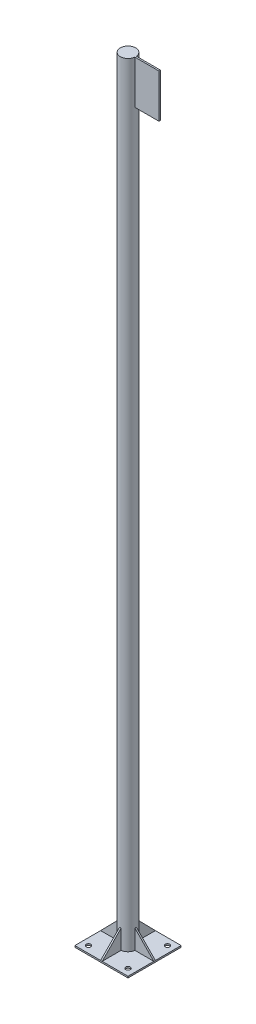
ISO-10303-21;
HEADER;
FILE_DESCRIPTION(('STEP AP214'),'2;1');
FILE_NAME('part.step','',(''),(''),'','','');
FILE_SCHEMA(('AUTOMOTIVE_DESIGN { 1 0 10303 214 1 1 1 1 }'));
ENDSEC;
DATA;
#1=APPLICATION_CONTEXT('core data for automotive mechanical design processes');
#2=APPLICATION_PROTOCOL_DEFINITION('international standard','automotive_design',2000,#1);
#3=PRODUCT_CONTEXT('',#1,'mechanical');
#4=PRODUCT('Part','Part','',(#3));
#5=PRODUCT_RELATED_PRODUCT_CATEGORY('part','',(#4));
#6=PRODUCT_DEFINITION_FORMATION('','',#4);
#7=PRODUCT_DEFINITION_CONTEXT('part definition',#1,'design');
#8=PRODUCT_DEFINITION('design','',#6,#7);
#9=PRODUCT_DEFINITION_SHAPE('','',#8);
#10=(LENGTH_UNIT() NAMED_UNIT(*) SI_UNIT(.MILLI.,.METRE.));
#11=(NAMED_UNIT(*) PLANE_ANGLE_UNIT() SI_UNIT($,.RADIAN.));
#12=(NAMED_UNIT(*) SI_UNIT($,.STERADIAN.) SOLID_ANGLE_UNIT());
#13=UNCERTAINTY_MEASURE_WITH_UNIT(LENGTH_MEASURE(1.E-05),#10,'distance_accuracy_value','');
#14=(GEOMETRIC_REPRESENTATION_CONTEXT(3) GLOBAL_UNCERTAINTY_ASSIGNED_CONTEXT((#13)) GLOBAL_UNIT_ASSIGNED_CONTEXT((#10,
#11,#12)) REPRESENTATION_CONTEXT('',''));
#15=CARTESIAN_POINT('',(0.,0.,0.));
#16=DIRECTION('',(0.,0.,1.));
#17=DIRECTION('',(1.,0.,0.));
#18=AXIS2_PLACEMENT_3D('',#15,#16,#17);
#19=CARTESIAN_POINT('',(0.,6.35,0.));
#20=DIRECTION('',(0.,-1.,0.));
#21=DIRECTION('',(0.,0.,-1.));
#22=AXIS2_PLACEMENT_3D('',#19,#20,#21);
#23=PLANE('',#22);
#24=CARTESIAN_POINT('',(191.715728752538,6.35,-28.2842712474619));
#25=DIRECTION('',(0.,1.,0.));
#26=DIRECTION('',(0.,0.,-1.));
#27=AXIS2_PLACEMENT_3D('',#24,#25,#26);
#28=CIRCLE('',#27,9.525);
#29=CARTESIAN_POINT('',(191.715728752538,6.35,-37.8092712474619));
#30=VERTEX_POINT('',#29);
#31=EDGE_CURVE('E216',#30,#30,#28,.T.);
#32=ORIENTED_EDGE('',*,*,#31,.F.);
#33=EDGE_LOOP('',(#32));
#34=FACE_BOUND('',#33,.T.);
#35=DIRECTION('',(1.,0.,0.));
#36=VECTOR('',#35,1.);
#37=CARTESIAN_POINT('',(220.,6.35,-106.825));
#38=LINE('',#37,#36);
#39=CARTESIAN_POINT('',(141.590851128135,6.34999999999986,-106.825));
#40=VERTEX_POINT('',#39);
#41=CARTESIAN_POINT('',(220.,6.35,-106.825));
#42=VERTEX_POINT('',#41);
#43=EDGE_CURVE('E276',#40,#42,#38,.T.);
#44=ORIENTED_EDGE('',*,*,#43,.F.);
#45=CARTESIAN_POINT('',(110.,6.34999999999986,-110.));
#46=DIRECTION('',(0.,-1.,0.));
#47=DIRECTION('',(0.,0.,-1.));
#48=AXIS2_PLACEMENT_3D('',#45,#46,#47);
#49=CIRCLE('',#48,31.75);
#50=CARTESIAN_POINT('',(113.175,6.34999999999986,-78.4091488718648));
#51=VERTEX_POINT('',#50);
#52=EDGE_CURVE('E41',#51,#40,#49,.F.);
#53=ORIENTED_EDGE('',*,*,#52,.F.);
#54=DIRECTION('',(0.,0.,-1.));
#55=VECTOR('',#54,1.);
#56=CARTESIAN_POINT('',(113.175,6.35,0.));
#57=LINE('',#56,#55);
#58=CARTESIAN_POINT('',(113.175,6.35,0.));
#59=VERTEX_POINT('',#58);
#60=EDGE_CURVE('E293',#59,#51,#57,.T.);
#61=ORIENTED_EDGE('',*,*,#60,.F.);
#62=DIRECTION('',(1.,0.,0.));
#63=VECTOR('',#62,1.);
#64=CARTESIAN_POINT('',(0.,6.35,0.));
#65=LINE('',#64,#63);
#66=CARTESIAN_POINT('',(220.,6.35,0.));
#67=VERTEX_POINT('',#66);
#68=EDGE_CURVE('E336',#59,#67,#65,.T.);
#69=ORIENTED_EDGE('',*,*,#68,.T.);
#70=DIRECTION('',(0.,0.,-1.));
#71=VECTOR('',#70,1.);
#72=CARTESIAN_POINT('',(220.,6.35,0.));
#73=LINE('',#72,#71);
#74=EDGE_CURVE('E342',#67,#42,#73,.T.);
#75=ORIENTED_EDGE('',*,*,#74,.T.);
#76=EDGE_LOOP('',(#44,#53,#61,#69,#75));
#77=FACE_BOUND('',#76,.T.);
#78=ADVANCED_FACE('F33',(#34,#77),#23,.F.);
#79=CARTESIAN_POINT('',(191.715728752538,6.35,-191.715728752538));
#80=DIRECTION('',(0.,1.,0.));
#81=DIRECTION('',(0.,0.,1.));
#82=AXIS2_PLACEMENT_3D('',#79,#80,#81);
#83=CIRCLE('',#82,9.52499999999999);
#84=CARTESIAN_POINT('',(191.715728752538,6.35,-182.190728752538));
#85=VERTEX_POINT('',#84);
#86=EDGE_CURVE('E215',#85,#85,#83,.T.);
#87=ORIENTED_EDGE('',*,*,#86,.F.);
#88=EDGE_LOOP('',(#87));
#89=FACE_BOUND('',#88,.T.);
#90=DIRECTION('',(-1.,0.,0.));
#91=VECTOR('',#90,1.);
#92=CARTESIAN_POINT('',(220.,6.35,-113.175));
#93=LINE('',#92,#91);
#94=CARTESIAN_POINT('',(220.,6.35,-113.175));
#95=VERTEX_POINT('',#94);
#96=CARTESIAN_POINT('',(141.590851128135,6.34999999999986,-113.175));
#97=VERTEX_POINT('',#96);
#98=EDGE_CURVE('E280',#95,#97,#93,.T.);
#99=ORIENTED_EDGE('',*,*,#98,.F.);
#100=CARTESIAN_POINT('',(220.,6.35,-220.));
#101=VERTEX_POINT('',#100);
#102=EDGE_CURVE('E341',#95,#101,#73,.T.);
#103=ORIENTED_EDGE('',*,*,#102,.T.);
#104=DIRECTION('',(-1.,0.,0.));
#105=VECTOR('',#104,1.);
#106=CARTESIAN_POINT('',(0.,6.35,-220.));
#107=LINE('',#106,#105);
#108=CARTESIAN_POINT('',(113.175,6.35,-220.));
#109=VERTEX_POINT('',#108);
#110=EDGE_CURVE('E346',#101,#109,#107,.T.);
#111=ORIENTED_EDGE('',*,*,#110,.T.);
#112=DIRECTION('',(0.,0.,-1.));
#113=VECTOR('',#112,1.);
#114=CARTESIAN_POINT('',(113.175,6.35,-220.));
#115=LINE('',#114,#113);
#116=CARTESIAN_POINT('',(113.175,6.34999999999986,-141.590851128135));
#117=VERTEX_POINT('',#116);
#118=EDGE_CURVE('E307',#117,#109,#115,.T.);
#119=ORIENTED_EDGE('',*,*,#118,.F.);
#120=EDGE_CURVE('E42',#97,#117,#49,.F.);
#121=ORIENTED_EDGE('',*,*,#120,.F.);
#122=EDGE_LOOP('',(#99,#103,#111,#119,#121));
#123=FACE_BOUND('',#122,.T.);
#124=ADVANCED_FACE('F447',(#89,#123),#23,.F.);
#125=CARTESIAN_POINT('',(110.,3206.35,-110.));
#126=DIRECTION('',(0.,-1.,0.));
#127=DIRECTION('',(0.,0.,-1.));
#128=AXIS2_PLACEMENT_3D('',#125,#126,#127);
#129=CYLINDRICAL_SURFACE('',#128,31.75);
#130=CARTESIAN_POINT('',(110.,3026.35,-110.));
#131=DIRECTION('',(0.,-1.,0.));
#132=DIRECTION('',(0.,0.,-1.));
#133=AXIS2_PLACEMENT_3D('',#130,#131,#132);
#134=CIRCLE('',#133,31.7500000000002);
#135=CARTESIAN_POINT('',(141.590851128135,3026.35,-113.175));
#136=VERTEX_POINT('',#135);
#137=CARTESIAN_POINT('',(141.590851128135,3026.35,-106.825));
#138=VERTEX_POINT('',#137);
#139=EDGE_CURVE('E192',#136,#138,#134,.T.);
#140=ORIENTED_EDGE('',*,*,#139,.T.);
#141=DIRECTION('',(0.,1.,0.));
#142=VECTOR('',#141,1.);
#143=CARTESIAN_POINT('',(141.590851128135,3026.35,-106.825));
#144=LINE('',#143,#142);
#145=CARTESIAN_POINT('',(141.590851128135,3206.35,-106.825));
#146=VERTEX_POINT('',#145);
#147=EDGE_CURVE('E208',#138,#146,#144,.T.);
#148=ORIENTED_EDGE('',*,*,#147,.T.);
#149=CARTESIAN_POINT('',(110.,3206.35,-110.));
#150=DIRECTION('',(0.,1.,0.));
#151=DIRECTION('',(0.,0.,1.));
#152=AXIS2_PLACEMENT_3D('',#149,#150,#151);
#153=CIRCLE('',#152,31.75);
#154=CARTESIAN_POINT('',(141.590851128135,3206.35,-113.175));
#155=VERTEX_POINT('',#154);
#156=EDGE_CURVE('E330',#155,#146,#153,.T.);
#157=ORIENTED_EDGE('',*,*,#156,.F.);
#158=DIRECTION('',(0.,1.,0.));
#159=VECTOR('',#158,1.);
#160=CARTESIAN_POINT('',(141.590851128135,3026.35,-113.175));
#161=LINE('',#160,#159);
#162=EDGE_CURVE('E182',#136,#155,#161,.T.);
#163=ORIENTED_EDGE('',*,*,#162,.F.);
#164=EDGE_LOOP('',(#140,#148,#157,#163));
#165=FACE_BOUND('',#164,.T.);
#166=DIRECTION('',(0.,-1.,0.));
#167=VECTOR('',#166,1.);
#168=CARTESIAN_POINT('',(141.590851128135,86.35,-106.825));
#169=LINE('',#168,#167);
#170=CARTESIAN_POINT('',(141.590851128135,86.3499999999999,-106.825));
#171=VERTEX_POINT('',#170);
#172=EDGE_CURVE('E286',#171,#40,#169,.T.);
#173=ORIENTED_EDGE('',*,*,#172,.F.);
#174=CARTESIAN_POINT('',(110.,86.35,-110.));
#175=DIRECTION('',(0.,-1.,0.));
#176=DIRECTION('',(0.,0.,1.));
#177=AXIS2_PLACEMENT_3D('',#174,#175,#176);
#178=CIRCLE('',#177,31.75);
#179=CARTESIAN_POINT('',(141.590851128135,86.3499999999999,-113.175));
#180=VERTEX_POINT('',#179);
#181=EDGE_CURVE('E278',#180,#171,#178,.T.);
#182=ORIENTED_EDGE('',*,*,#181,.F.);
#183=DIRECTION('',(0.,-1.,0.));
#184=VECTOR('',#183,1.);
#185=CARTESIAN_POINT('',(141.590851128135,86.35,-113.175));
#186=LINE('',#185,#184);
#187=EDGE_CURVE('E58',#180,#97,#186,.T.);
#188=ORIENTED_EDGE('',*,*,#187,.T.);
#189=ORIENTED_EDGE('',*,*,#120,.T.);
#190=DIRECTION('',(0.,-1.,0.));
#191=VECTOR('',#190,1.);
#192=CARTESIAN_POINT('',(113.175,86.35,-141.590851128135));
#193=LINE('',#192,#191);
#194=CARTESIAN_POINT('',(113.175,86.3499999999999,-141.590851128135));
#195=VERTEX_POINT('',#194);
#196=EDGE_CURVE('E306',#195,#117,#193,.T.);
#197=ORIENTED_EDGE('',*,*,#196,.F.);
#198=CARTESIAN_POINT('',(110.,86.35,-110.));
#199=DIRECTION('',(0.,-1.,0.));
#200=DIRECTION('',(0.,0.,-1.));
#201=AXIS2_PLACEMENT_3D('',#198,#199,#200);
#202=CIRCLE('',#201,31.7500000000003);
#203=CARTESIAN_POINT('',(106.825,86.3499999999999,-141.590851128135));
#204=VERTEX_POINT('',#203);
#205=EDGE_CURVE('E303',#204,#195,#202,.T.);
#206=ORIENTED_EDGE('',*,*,#205,.F.);
#207=DIRECTION('',(0.,-1.,0.));
#208=VECTOR('',#207,1.);
#209=CARTESIAN_POINT('',(106.825,86.35,-141.590851128135));
#210=LINE('',#209,#208);
#211=CARTESIAN_POINT('',(106.825,6.34999999999986,-141.590851128135));
#212=VERTEX_POINT('',#211);
#213=EDGE_CURVE('E314',#204,#212,#210,.T.);
#214=ORIENTED_EDGE('',*,*,#213,.T.);
#215=CARTESIAN_POINT('',(78.4091488718648,6.34999999999986,-113.175));
#216=VERTEX_POINT('',#215);
#217=EDGE_CURVE('E43',#212,#216,#49,.F.);
#218=ORIENTED_EDGE('',*,*,#217,.T.);
#219=DIRECTION('',(0.,-1.,0.));
#220=VECTOR('',#219,1.);
#221=CARTESIAN_POINT('',(78.4091488718648,86.35,-113.175));
#222=LINE('',#221,#220);
#223=CARTESIAN_POINT('',(78.4091488718648,86.35,-113.175));
#224=VERTEX_POINT('',#223);
#225=EDGE_CURVE('E320',#224,#216,#222,.T.);
#226=ORIENTED_EDGE('',*,*,#225,.F.);
#227=CARTESIAN_POINT('',(110.,86.35,-110.));
#228=DIRECTION('',(0.,-1.,0.));
#229=DIRECTION('',(0.,0.,-1.));
#230=AXIS2_PLACEMENT_3D('',#227,#228,#229);
#231=CIRCLE('',#230,31.75);
#232=CARTESIAN_POINT('',(78.4091488718648,86.3499999999999,-106.825));
#233=VERTEX_POINT('',#232);
#234=EDGE_CURVE('E317',#233,#224,#231,.T.);
#235=ORIENTED_EDGE('',*,*,#234,.F.);
#236=DIRECTION('',(0.,-1.,0.));
#237=VECTOR('',#236,1.);
#238=CARTESIAN_POINT('',(78.4091488718648,86.35,-106.825));
#239=LINE('',#238,#237);
#240=CARTESIAN_POINT('',(78.4091488718648,6.34999999999986,-106.825));
#241=VERTEX_POINT('',#240);
#242=EDGE_CURVE('E328',#233,#241,#239,.T.);
#243=ORIENTED_EDGE('',*,*,#242,.T.);
#244=CARTESIAN_POINT('',(106.825,6.34999999999986,-78.4091488718648));
#245=VERTEX_POINT('',#244);
#246=EDGE_CURVE('E11',#241,#245,#49,.F.);
#247=ORIENTED_EDGE('',*,*,#246,.T.);
#248=DIRECTION('',(0.,-1.,0.));
#249=VECTOR('',#248,1.);
#250=CARTESIAN_POINT('',(106.825,86.35,-78.4091488718648));
#251=LINE('',#250,#249);
#252=CARTESIAN_POINT('',(106.825,86.3499999999999,-78.4091488718648));
#253=VERTEX_POINT('',#252);
#254=EDGE_CURVE('E299',#253,#245,#251,.T.);
#255=ORIENTED_EDGE('',*,*,#254,.F.);
#256=CARTESIAN_POINT('',(110.,86.35,-110.));
#257=DIRECTION('',(0.,-1.,0.));
#258=DIRECTION('',(0.,0.,1.));
#259=AXIS2_PLACEMENT_3D('',#256,#257,#258);
#260=CIRCLE('',#259,31.7499999999997);
#261=CARTESIAN_POINT('',(113.175,86.3499999999999,-78.4091488718648));
#262=VERTEX_POINT('',#261);
#263=EDGE_CURVE('E290',#262,#253,#260,.T.);
#264=ORIENTED_EDGE('',*,*,#263,.F.);
#265=DIRECTION('',(0.,-1.,0.));
#266=VECTOR('',#265,1.);
#267=CARTESIAN_POINT('',(113.175,86.35,-78.4091488718648));
#268=LINE('',#267,#266);
#269=EDGE_CURVE('E292',#262,#51,#268,.T.);
#270=ORIENTED_EDGE('',*,*,#269,.T.);
#271=ORIENTED_EDGE('',*,*,#52,.T.);
#272=EDGE_LOOP('',(#173,#182,#188,#189,#197,#206,#214,#218,#226,#235,#243,#247,#255,#264,#270,#271));
#273=FACE_BOUND('',#272,.T.);
#274=ADVANCED_FACE('F376',(#165,#273),#129,.T.);
#275=CARTESIAN_POINT('',(28.2842712474619,6.35,-28.2842712474619));
#276=DIRECTION('',(0.,1.,0.));
#277=DIRECTION('',(0.,0.,1.));
#278=AXIS2_PLACEMENT_3D('',#275,#276,#277);
#279=CIRCLE('',#278,9.525);
#280=CARTESIAN_POINT('',(28.2842712474619,6.35,-18.7592712474619));
#281=VERTEX_POINT('',#280);
#282=EDGE_CURVE('E222',#281,#281,#279,.T.);
#283=ORIENTED_EDGE('',*,*,#282,.F.);
#284=EDGE_LOOP('',(#283));
#285=FACE_BOUND('',#284,.T.);
#286=DIRECTION('',(0.,0.,1.));
#287=VECTOR('',#286,1.);
#288=CARTESIAN_POINT('',(106.825,6.35,0.));
#289=LINE('',#288,#287);
#290=CARTESIAN_POINT('',(106.825,6.35,0.));
#291=VERTEX_POINT('',#290);
#292=EDGE_CURVE('E289',#245,#291,#289,.T.);
#293=ORIENTED_EDGE('',*,*,#292,.F.);
#294=ORIENTED_EDGE('',*,*,#246,.F.);
#295=DIRECTION('',(1.,0.,0.));
#296=VECTOR('',#295,1.);
#297=CARTESIAN_POINT('',(0.,6.35,-106.825));
#298=LINE('',#297,#296);
#299=CARTESIAN_POINT('',(0.,6.35,-106.825));
#300=VERTEX_POINT('',#299);
#301=EDGE_CURVE('E316',#300,#241,#298,.T.);
#302=ORIENTED_EDGE('',*,*,#301,.F.);
#303=DIRECTION('',(0.,0.,1.));
#304=VECTOR('',#303,1.);
#305=CARTESIAN_POINT('',(0.,6.35,0.));
#306=LINE('',#305,#304);
#307=CARTESIAN_POINT('',(0.,6.35,0.));
#308=VERTEX_POINT('',#307);
#309=EDGE_CURVE('E337',#300,#308,#306,.T.);
#310=ORIENTED_EDGE('',*,*,#309,.T.);
#311=EDGE_CURVE('E338',#308,#291,#65,.T.);
#312=ORIENTED_EDGE('',*,*,#311,.T.);
#313=EDGE_LOOP('',(#293,#294,#302,#310,#312));
#314=FACE_BOUND('',#313,.T.);
#315=ADVANCED_FACE('F424',(#285,#314),#23,.F.);
#316=CARTESIAN_POINT('',(28.2842712474619,6.35,-191.715728752538));
#317=DIRECTION('',(0.,1.,0.));
#318=DIRECTION('',(0.,0.,-1.));
#319=AXIS2_PLACEMENT_3D('',#316,#317,#318);
#320=CIRCLE('',#319,9.525);
#321=CARTESIAN_POINT('',(28.2842712474619,6.35,-201.240728752538));
#322=VERTEX_POINT('',#321);
#323=EDGE_CURVE('E207',#322,#322,#320,.T.);
#324=ORIENTED_EDGE('',*,*,#323,.F.);
#325=EDGE_LOOP('',(#324));
#326=FACE_BOUND('',#325,.T.);
#327=DIRECTION('',(0.,0.,1.));
#328=VECTOR('',#327,1.);
#329=CARTESIAN_POINT('',(106.825,6.35,-220.));
#330=LINE('',#329,#328);
#331=CARTESIAN_POINT('',(106.825,6.35,-220.));
#332=VERTEX_POINT('',#331);
#333=EDGE_CURVE('E302',#332,#212,#330,.T.);
#334=ORIENTED_EDGE('',*,*,#333,.F.);
#335=CARTESIAN_POINT('',(0.,6.35,-220.));
#336=VERTEX_POINT('',#335);
#337=EDGE_CURVE('E345',#332,#336,#107,.T.);
#338=ORIENTED_EDGE('',*,*,#337,.T.);
#339=CARTESIAN_POINT('',(0.,6.35,-113.175));
#340=VERTEX_POINT('',#339);
#341=EDGE_CURVE('E333',#336,#340,#306,.T.);
#342=ORIENTED_EDGE('',*,*,#341,.T.);
#343=DIRECTION('',(-1.,0.,0.));
#344=VECTOR('',#343,1.);
#345=CARTESIAN_POINT('',(0.,6.35,-113.175));
#346=LINE('',#345,#344);
#347=EDGE_CURVE('E321',#216,#340,#346,.T.);
#348=ORIENTED_EDGE('',*,*,#347,.F.);
#349=ORIENTED_EDGE('',*,*,#217,.F.);
#350=EDGE_LOOP('',(#334,#338,#342,#348,#349));
#351=FACE_BOUND('',#350,.T.);
#352=ADVANCED_FACE('F412',(#326,#351),#23,.F.);
#353=CARTESIAN_POINT('',(0.,6.35,0.));
#354=DIRECTION('',(1.,0.,0.));
#355=DIRECTION('',(0.,0.,-1.));
#356=AXIS2_PLACEMENT_3D('',#353,#354,#355);
#357=PLANE('',#356);
#358=ORIENTED_EDGE('',*,*,#309,.F.);
#359=DIRECTION('',(0.,0.,1.));
#360=VECTOR('',#359,1.);
#361=CARTESIAN_POINT('',(0.,6.35,-113.175));
#362=LINE('',#361,#360);
#363=EDGE_CURVE('E271',#340,#300,#362,.T.);
#364=ORIENTED_EDGE('',*,*,#363,.F.);
#365=ORIENTED_EDGE('',*,*,#341,.F.);
#366=DIRECTION('',(0.,-1.,0.));
#367=VECTOR('',#366,1.);
#368=CARTESIAN_POINT('',(0.,6.35,-220.));
#369=LINE('',#368,#367);
#370=CARTESIAN_POINT('',(0.,0.,-220.));
#371=VERTEX_POINT('',#370);
#372=EDGE_CURVE('E349',#336,#371,#369,.T.);
#373=ORIENTED_EDGE('',*,*,#372,.T.);
#374=DIRECTION('',(0.,0.,1.));
#375=VECTOR('',#374,1.);
#376=CARTESIAN_POINT('',(0.,0.,0.));
#377=LINE('',#376,#375);
#378=CARTESIAN_POINT('',(0.,0.,0.));
#379=VERTEX_POINT('',#378);
#380=EDGE_CURVE('E332',#371,#379,#377,.T.);
#381=ORIENTED_EDGE('',*,*,#380,.T.);
#382=DIRECTION('',(0.,-1.,0.));
#383=VECTOR('',#382,1.);
#384=CARTESIAN_POINT('',(0.,6.35,0.));
#385=LINE('',#384,#383);
#386=EDGE_CURVE('E365',#308,#379,#385,.T.);
#387=ORIENTED_EDGE('',*,*,#386,.F.);
#388=EDGE_LOOP('',(#358,#364,#365,#373,#381,#387));
#389=FACE_BOUND('',#388,.T.);
#390=ADVANCED_FACE('F35',(#389),#357,.F.);
#391=CARTESIAN_POINT('',(0.,6.35,0.));
#392=DIRECTION('',(0.,0.,-1.));
#393=DIRECTION('',(-1.,0.,0.));
#394=AXIS2_PLACEMENT_3D('',#391,#392,#393);
#395=PLANE('',#394);
#396=ORIENTED_EDGE('',*,*,#68,.F.);
#397=DIRECTION('',(-1.,0.,0.));
#398=VECTOR('',#397,1.);
#399=CARTESIAN_POINT('',(113.175,6.35,0.));
#400=LINE('',#399,#398);
#401=EDGE_CURVE('E241',#59,#291,#400,.T.);
#402=ORIENTED_EDGE('',*,*,#401,.T.);
#403=ORIENTED_EDGE('',*,*,#311,.F.);
#404=ORIENTED_EDGE('',*,*,#386,.T.);
#405=DIRECTION('',(1.,0.,0.));
#406=VECTOR('',#405,1.);
#407=CARTESIAN_POINT('',(0.,0.,0.));
#408=LINE('',#407,#406);
#409=CARTESIAN_POINT('',(220.,0.,0.));
#410=VERTEX_POINT('',#409);
#411=EDGE_CURVE('E352',#379,#410,#408,.T.);
#412=ORIENTED_EDGE('',*,*,#411,.T.);
#413=DIRECTION('',(0.,-1.,0.));
#414=VECTOR('',#413,1.);
#415=CARTESIAN_POINT('',(220.,6.35,0.));
#416=LINE('',#415,#414);
#417=EDGE_CURVE('E363',#67,#410,#416,.T.);
#418=ORIENTED_EDGE('',*,*,#417,.F.);
#419=EDGE_LOOP('',(#396,#402,#403,#404,#412,#418));
#420=FACE_BOUND('',#419,.T.);
#421=ADVANCED_FACE('F395',(#420),#395,.F.);
#422=CARTESIAN_POINT('',(220.,6.35,0.));
#423=DIRECTION('',(-1.,0.,0.));
#424=DIRECTION('',(0.,0.,1.));
#425=AXIS2_PLACEMENT_3D('',#422,#423,#424);
#426=PLANE('',#425);
#427=ORIENTED_EDGE('',*,*,#102,.F.);
#428=DIRECTION('',(0.,0.,1.));
#429=VECTOR('',#428,1.);
#430=CARTESIAN_POINT('',(220.,6.35,-113.175));
#431=LINE('',#430,#429);
#432=EDGE_CURVE('E260',#95,#42,#431,.T.);
#433=ORIENTED_EDGE('',*,*,#432,.T.);
#434=ORIENTED_EDGE('',*,*,#74,.F.);
#435=ORIENTED_EDGE('',*,*,#417,.T.);
#436=DIRECTION('',(0.,0.,-1.));
#437=VECTOR('',#436,1.);
#438=CARTESIAN_POINT('',(220.,0.,0.));
#439=LINE('',#438,#437);
#440=CARTESIAN_POINT('',(220.,0.,-220.));
#441=VERTEX_POINT('',#440);
#442=EDGE_CURVE('E354',#410,#441,#439,.T.);
#443=ORIENTED_EDGE('',*,*,#442,.T.);
#444=DIRECTION('',(0.,-1.,0.));
#445=VECTOR('',#444,1.);
#446=CARTESIAN_POINT('',(220.,6.35,-220.));
#447=LINE('',#446,#445);
#448=EDGE_CURVE('E360',#101,#441,#447,.T.);
#449=ORIENTED_EDGE('',*,*,#448,.F.);
#450=EDGE_LOOP('',(#427,#433,#434,#435,#443,#449));
#451=FACE_BOUND('',#450,.T.);
#452=ADVANCED_FACE('F390',(#451),#426,.F.);
#453=CARTESIAN_POINT('',(0.,6.35,-220.));
#454=DIRECTION('',(0.,0.,1.));
#455=DIRECTION('',(1.,0.,0.));
#456=AXIS2_PLACEMENT_3D('',#453,#454,#455);
#457=PLANE('',#456);
#458=ORIENTED_EDGE('',*,*,#337,.F.);
#459=DIRECTION('',(-1.,0.,0.));
#460=VECTOR('',#459,1.);
#461=CARTESIAN_POINT('',(113.175,6.35,-220.));
#462=LINE('',#461,#460);
#463=EDGE_CURVE('E250',#109,#332,#462,.T.);
#464=ORIENTED_EDGE('',*,*,#463,.F.);
#465=ORIENTED_EDGE('',*,*,#110,.F.);
#466=ORIENTED_EDGE('',*,*,#448,.T.);
#467=DIRECTION('',(-1.,0.,0.));
#468=VECTOR('',#467,1.);
#469=CARTESIAN_POINT('',(0.,0.,-220.));
#470=LINE('',#469,#468);
#471=EDGE_CURVE('E356',#441,#371,#470,.T.);
#472=ORIENTED_EDGE('',*,*,#471,.T.);
#473=ORIENTED_EDGE('',*,*,#372,.F.);
#474=EDGE_LOOP('',(#458,#464,#465,#466,#472,#473));
#475=FACE_BOUND('',#474,.T.);
#476=ADVANCED_FACE('F404',(#475),#457,.F.);
#477=CARTESIAN_POINT('',(0.,0.,0.));
#478=DIRECTION('',(0.,-1.,0.));
#479=DIRECTION('',(0.,0.,-1.));
#480=AXIS2_PLACEMENT_3D('',#477,#478,#479);
#481=PLANE('',#480);
#482=CARTESIAN_POINT('',(191.715728752538,0.,-28.2842712474619));
#483=DIRECTION('',(0.,1.,0.));
#484=DIRECTION('',(0.,0.,-1.));
#485=AXIS2_PLACEMENT_3D('',#482,#483,#484);
#486=CIRCLE('',#485,9.525);
#487=CARTESIAN_POINT('',(191.715728752538,0.,-37.8092712474619));
#488=VERTEX_POINT('',#487);
#489=EDGE_CURVE('E212',#488,#488,#486,.T.);
#490=ORIENTED_EDGE('',*,*,#489,.T.);
#491=EDGE_LOOP('',(#490));
#492=FACE_BOUND('',#491,.T.);
#493=CARTESIAN_POINT('',(28.2842712474619,0.,-28.2842712474619));
#494=DIRECTION('',(0.,1.,0.));
#495=DIRECTION('',(0.,0.,1.));
#496=AXIS2_PLACEMENT_3D('',#493,#494,#495);
#497=CIRCLE('',#496,9.525);
#498=CARTESIAN_POINT('',(28.2842712474619,0.,-18.7592712474619));
#499=VERTEX_POINT('',#498);
#500=EDGE_CURVE('E219',#499,#499,#497,.T.);
#501=ORIENTED_EDGE('',*,*,#500,.T.);
#502=EDGE_LOOP('',(#501));
#503=FACE_BOUND('',#502,.T.);
#504=CARTESIAN_POINT('',(28.2842712474619,0.,-191.715728752538));
#505=DIRECTION('',(0.,1.,0.));
#506=DIRECTION('',(0.,0.,-1.));
#507=AXIS2_PLACEMENT_3D('',#504,#505,#506);
#508=CIRCLE('',#507,9.525);
#509=CARTESIAN_POINT('',(28.2842712474619,0.,-201.240728752538));
#510=VERTEX_POINT('',#509);
#511=EDGE_CURVE('E225',#510,#510,#508,.T.);
#512=ORIENTED_EDGE('',*,*,#511,.T.);
#513=EDGE_LOOP('',(#512));
#514=FACE_BOUND('',#513,.T.);
#515=CARTESIAN_POINT('',(191.715728752538,0.,-191.715728752538));
#516=DIRECTION('',(0.,1.,0.));
#517=DIRECTION('',(0.,0.,1.));
#518=AXIS2_PLACEMENT_3D('',#515,#516,#517);
#519=CIRCLE('',#518,9.52499999999999);
#520=CARTESIAN_POINT('',(191.715728752538,0.,-182.190728752538));
#521=VERTEX_POINT('',#520);
#522=EDGE_CURVE('E230',#521,#521,#519,.T.);
#523=ORIENTED_EDGE('',*,*,#522,.T.);
#524=EDGE_LOOP('',(#523));
#525=FACE_BOUND('',#524,.T.);
#526=ORIENTED_EDGE('',*,*,#380,.F.);
#527=ORIENTED_EDGE('',*,*,#471,.F.);
#528=ORIENTED_EDGE('',*,*,#442,.F.);
#529=ORIENTED_EDGE('',*,*,#411,.F.);
#530=EDGE_LOOP('',(#526,#527,#528,#529));
#531=FACE_BOUND('',#530,.T.);
#532=ADVANCED_FACE('F400',(#492,#503,#514,#525,#531),#481,.T.);
#533=CARTESIAN_POINT('',(110.,3206.35,-110.));
#534=DIRECTION('',(0.,1.,0.));
#535=DIRECTION('',(0.,0.,1.));
#536=AXIS2_PLACEMENT_3D('',#533,#534,#535);
#537=PLANE('',#536);
#538=ORIENTED_EDGE('',*,*,#156,.T.);
#539=DIRECTION('',(1.,0.,0.));
#540=VECTOR('',#539,1.);
#541=CARTESIAN_POINT('',(241.590851128135,3206.35,-106.825));
#542=LINE('',#541,#540);
#543=CARTESIAN_POINT('',(241.590851128135,3206.35,-106.825));
#544=VERTEX_POINT('',#543);
#545=EDGE_CURVE('E196',#146,#544,#542,.T.);
#546=ORIENTED_EDGE('',*,*,#545,.T.);
#547=DIRECTION('',(0.,0.,-1.));
#548=VECTOR('',#547,1.);
#549=CARTESIAN_POINT('',(241.590851128135,3206.35,-113.175));
#550=LINE('',#549,#548);
#551=CARTESIAN_POINT('',(241.590851128135,3206.35,-113.175));
#552=VERTEX_POINT('',#551);
#553=EDGE_CURVE('E203',#544,#552,#550,.T.);
#554=ORIENTED_EDGE('',*,*,#553,.T.);
#555=DIRECTION('',(-1.,0.,0.));
#556=VECTOR('',#555,1.);
#557=CARTESIAN_POINT('',(241.590851128135,3206.35,-113.175));
#558=LINE('',#557,#556);
#559=EDGE_CURVE('E50',#552,#155,#558,.T.);
#560=ORIENTED_EDGE('',*,*,#559,.T.);
#561=EDGE_LOOP('',(#538,#546,#554,#560));
#562=FACE_BOUND('',#561,.T.);
#563=ADVANCED_FACE('F534',(#562),#537,.T.);
#564=CARTESIAN_POINT('',(0.,86.35,-106.825));
#565=DIRECTION('',(0.,0.,-1.));
#566=DIRECTION('',(-1.,0.,0.));
#567=AXIS2_PLACEMENT_3D('',#564,#565,#566);
#568=PLANE('',#567);
#569=ORIENTED_EDGE('',*,*,#242,.F.);
#570=DIRECTION('',(0.699970242744331,0.714172009583435,0.));
#571=VECTOR('',#570,1.);
#572=CARTESIAN_POINT('',(78.4091488718648,86.3499999999999,-106.825));
#573=LINE('',#572,#571);
#574=EDGE_CURVE('E265',#300,#233,#573,.T.);
#575=ORIENTED_EDGE('',*,*,#574,.F.);
#576=ORIENTED_EDGE('',*,*,#301,.T.);
#577=EDGE_LOOP('',(#569,#575,#576));
#578=FACE_BOUND('',#577,.T.);
#579=ADVANCED_FACE('F421',(#578),#568,.F.);
#580=CARTESIAN_POINT('',(0.,86.35,-113.175));
#581=DIRECTION('',(0.,0.,1.));
#582=DIRECTION('',(1.,0.,0.));
#583=AXIS2_PLACEMENT_3D('',#580,#581,#582);
#584=PLANE('',#583);
#585=ORIENTED_EDGE('',*,*,#347,.T.);
#586=DIRECTION('',(0.699970242744331,0.714172009583435,0.));
#587=VECTOR('',#586,1.);
#588=CARTESIAN_POINT('',(78.4091488718648,86.3499999999999,-113.175));
#589=LINE('',#588,#587);
#590=EDGE_CURVE('E268',#340,#224,#589,.T.);
#591=ORIENTED_EDGE('',*,*,#590,.T.);
#592=ORIENTED_EDGE('',*,*,#225,.T.);
#593=EDGE_LOOP('',(#585,#591,#592));
#594=FACE_BOUND('',#593,.T.);
#595=ADVANCED_FACE('F414',(#594),#584,.F.);
#596=CARTESIAN_POINT('',(106.825,86.35,-220.));
#597=DIRECTION('',(1.,0.,0.));
#598=DIRECTION('',(0.,0.,-1.));
#599=AXIS2_PLACEMENT_3D('',#596,#597,#598);
#600=PLANE('',#599);
#601=ORIENTED_EDGE('',*,*,#213,.F.);
#602=DIRECTION('',(0.,0.714172009583435,0.699970242744331));
#603=VECTOR('',#602,1.);
#604=CARTESIAN_POINT('',(106.825,6.35,-220.));
#605=LINE('',#604,#603);
#606=EDGE_CURVE('E244',#332,#204,#605,.T.);
#607=ORIENTED_EDGE('',*,*,#606,.F.);
#608=ORIENTED_EDGE('',*,*,#333,.T.);
#609=EDGE_LOOP('',(#601,#607,#608));
#610=FACE_BOUND('',#609,.T.);
#611=ADVANCED_FACE('F522',(#610),#600,.F.);
#612=CARTESIAN_POINT('',(113.175,86.35,-220.));
#613=DIRECTION('',(-1.,0.,0.));
#614=DIRECTION('',(0.,0.,1.));
#615=AXIS2_PLACEMENT_3D('',#612,#613,#614);
#616=PLANE('',#615);
#617=ORIENTED_EDGE('',*,*,#118,.T.);
#618=DIRECTION('',(0.,0.714172009583435,0.699970242744331));
#619=VECTOR('',#618,1.);
#620=CARTESIAN_POINT('',(113.175,6.35,-220.));
#621=LINE('',#620,#619);
#622=EDGE_CURVE('E247',#109,#195,#621,.T.);
#623=ORIENTED_EDGE('',*,*,#622,.T.);
#624=ORIENTED_EDGE('',*,*,#196,.T.);
#625=EDGE_LOOP('',(#617,#623,#624));
#626=FACE_BOUND('',#625,.T.);
#627=ADVANCED_FACE('F444',(#626),#616,.F.);
#628=CARTESIAN_POINT('',(106.825,86.35,0.));
#629=DIRECTION('',(1.,0.,0.));
#630=DIRECTION('',(0.,0.,-1.));
#631=AXIS2_PLACEMENT_3D('',#628,#629,#630);
#632=PLANE('',#631);
#633=ORIENTED_EDGE('',*,*,#292,.T.);
#634=DIRECTION('',(0.,-0.714172009583435,0.699970242744331));
#635=VECTOR('',#634,1.);
#636=CARTESIAN_POINT('',(106.825,86.3499999999999,-78.4091488718648));
#637=LINE('',#636,#635);
#638=EDGE_CURVE('E233',#253,#291,#637,.T.);
#639=ORIENTED_EDGE('',*,*,#638,.F.);
#640=ORIENTED_EDGE('',*,*,#254,.T.);
#641=EDGE_LOOP('',(#633,#639,#640));
#642=FACE_BOUND('',#641,.T.);
#643=ADVANCED_FACE('F428',(#642),#632,.F.);
#644=CARTESIAN_POINT('',(113.175,86.35,0.));
#645=DIRECTION('',(-1.,0.,0.));
#646=DIRECTION('',(0.,0.,1.));
#647=AXIS2_PLACEMENT_3D('',#644,#645,#646);
#648=PLANE('',#647);
#649=ORIENTED_EDGE('',*,*,#269,.F.);
#650=DIRECTION('',(0.,-0.714172009583435,0.699970242744331));
#651=VECTOR('',#650,1.);
#652=CARTESIAN_POINT('',(113.175,86.3499999999999,-78.4091488718648));
#653=LINE('',#652,#651);
#654=EDGE_CURVE('E236',#262,#59,#653,.T.);
#655=ORIENTED_EDGE('',*,*,#654,.T.);
#656=ORIENTED_EDGE('',*,*,#60,.T.);
#657=EDGE_LOOP('',(#649,#655,#656));
#658=FACE_BOUND('',#657,.T.);
#659=ADVANCED_FACE('F435',(#658),#648,.F.);
#660=CARTESIAN_POINT('',(220.,86.35,-106.825));
#661=DIRECTION('',(0.,0.,-1.));
#662=DIRECTION('',(-1.,0.,0.));
#663=AXIS2_PLACEMENT_3D('',#660,#661,#662);
#664=PLANE('',#663);
#665=ORIENTED_EDGE('',*,*,#43,.T.);
#666=DIRECTION('',(0.699970242744331,-0.714172009583435,0.));
#667=VECTOR('',#666,1.);
#668=CARTESIAN_POINT('',(220.,6.35,-106.825));
#669=LINE('',#668,#667);
#670=EDGE_CURVE('E255',#171,#42,#669,.T.);
#671=ORIENTED_EDGE('',*,*,#670,.F.);
#672=ORIENTED_EDGE('',*,*,#172,.T.);
#673=EDGE_LOOP('',(#665,#671,#672));
#674=FACE_BOUND('',#673,.T.);
#675=ADVANCED_FACE('F383',(#674),#664,.F.);
#676=CARTESIAN_POINT('',(220.,86.35,-113.175));
#677=DIRECTION('',(0.,0.,1.));
#678=DIRECTION('',(1.,0.,0.));
#679=AXIS2_PLACEMENT_3D('',#676,#677,#678);
#680=PLANE('',#679);
#681=ORIENTED_EDGE('',*,*,#187,.F.);
#682=DIRECTION('',(0.699970242744331,-0.714172009583435,0.));
#683=VECTOR('',#682,1.);
#684=CARTESIAN_POINT('',(220.,6.35,-113.175));
#685=LINE('',#684,#683);
#686=EDGE_CURVE('E257',#180,#95,#685,.T.);
#687=ORIENTED_EDGE('',*,*,#686,.T.);
#688=ORIENTED_EDGE('',*,*,#98,.T.);
#689=EDGE_LOOP('',(#681,#687,#688));
#690=FACE_BOUND('',#689,.T.);
#691=ADVANCED_FACE('F442',(#690),#680,.F.);
#692=CARTESIAN_POINT('',(0.,86.35,-113.175));
#693=DIRECTION('',(0.,1.,0.));
#694=DIRECTION('',(-1.,0.,0.));
#695=AXIS2_PLACEMENT_3D('',#692,#693,#694);
#696=PLANE('',#695);
#697=DIRECTION('',(0.,0.,1.));
#698=VECTOR('',#697,1.);
#699=CARTESIAN_POINT('',(78.4091488718648,86.3499999999999,-113.175));
#700=LINE('',#699,#698);
#701=EDGE_CURVE('E274',#224,#233,#700,.T.);
#702=ORIENTED_EDGE('',*,*,#701,.T.);
#703=ORIENTED_EDGE('',*,*,#234,.T.);
#704=EDGE_LOOP('',(#702,#703));
#705=FACE_BOUND('',#704,.T.);
#706=ADVANCED_FACE('F505',(#705),#696,.F.);
#707=CARTESIAN_POINT('',(78.4091488718648,86.3499999999999,-113.175));
#708=DIRECTION('',(0.714172009583435,-0.699970242744331,0.));
#709=DIRECTION('',(0.699970242744331,0.714172009583435,0.));
#710=AXIS2_PLACEMENT_3D('',#707,#708,#709);
#711=PLANE('',#710);
#712=ORIENTED_EDGE('',*,*,#574,.T.);
#713=ORIENTED_EDGE('',*,*,#701,.F.);
#714=ORIENTED_EDGE('',*,*,#590,.F.);
#715=ORIENTED_EDGE('',*,*,#363,.T.);
#716=EDGE_LOOP('',(#712,#713,#714,#715));
#717=FACE_BOUND('',#716,.T.);
#718=ADVANCED_FACE('F499',(#717),#711,.F.);
#719=CARTESIAN_POINT('',(141.590851128135,86.3499999999999,-113.175));
#720=DIRECTION('',(0.,1.,0.));
#721=DIRECTION('',(-1.,0.,0.));
#722=AXIS2_PLACEMENT_3D('',#719,#720,#721);
#723=PLANE('',#722);
#724=DIRECTION('',(0.,0.,1.));
#725=VECTOR('',#724,1.);
#726=CARTESIAN_POINT('',(141.590851128135,86.3499999999999,-113.175));
#727=LINE('',#726,#725);
#728=EDGE_CURVE('E262',#180,#171,#727,.T.);
#729=ORIENTED_EDGE('',*,*,#728,.F.);
#730=ORIENTED_EDGE('',*,*,#181,.T.);
#731=EDGE_LOOP('',(#729,#730));
#732=FACE_BOUND('',#731,.T.);
#733=ADVANCED_FACE('F496',(#732),#723,.F.);
#734=CARTESIAN_POINT('',(220.,6.35,-113.175));
#735=DIRECTION('',(-0.714172009583435,-0.699970242744331,0.));
#736=DIRECTION('',(0.699970242744331,-0.714172009583435,0.));
#737=AXIS2_PLACEMENT_3D('',#734,#735,#736);
#738=PLANE('',#737);
#739=ORIENTED_EDGE('',*,*,#670,.T.);
#740=ORIENTED_EDGE('',*,*,#432,.F.);
#741=ORIENTED_EDGE('',*,*,#686,.F.);
#742=ORIENTED_EDGE('',*,*,#728,.T.);
#743=EDGE_LOOP('',(#739,#740,#741,#742));
#744=FACE_BOUND('',#743,.T.);
#745=ADVANCED_FACE('F385',(#744),#738,.F.);
#746=CARTESIAN_POINT('',(113.175,86.3499999999999,-141.590851128135));
#747=DIRECTION('',(0.,1.,0.));
#748=DIRECTION('',(0.,0.,1.));
#749=AXIS2_PLACEMENT_3D('',#746,#747,#748);
#750=PLANE('',#749);
#751=DIRECTION('',(-1.,0.,0.));
#752=VECTOR('',#751,1.);
#753=CARTESIAN_POINT('',(113.175,86.3499999999999,-141.590851128135));
#754=LINE('',#753,#752);
#755=EDGE_CURVE('E253',#195,#204,#754,.T.);
#756=ORIENTED_EDGE('',*,*,#755,.T.);
#757=ORIENTED_EDGE('',*,*,#205,.T.);
#758=EDGE_LOOP('',(#756,#757));
#759=FACE_BOUND('',#758,.T.);
#760=ADVANCED_FACE('F489',(#759),#750,.F.);
#761=CARTESIAN_POINT('',(113.175,6.35,-220.));
#762=DIRECTION('',(0.,-0.699970242744331,0.714172009583435));
#763=DIRECTION('',(0.,-0.714172009583435,-0.699970242744331));
#764=AXIS2_PLACEMENT_3D('',#761,#762,#763);
#765=PLANE('',#764);
#766=ORIENTED_EDGE('',*,*,#606,.T.);
#767=ORIENTED_EDGE('',*,*,#755,.F.);
#768=ORIENTED_EDGE('',*,*,#622,.F.);
#769=ORIENTED_EDGE('',*,*,#463,.T.);
#770=EDGE_LOOP('',(#766,#767,#768,#769));
#771=FACE_BOUND('',#770,.T.);
#772=ADVANCED_FACE('F488',(#771),#765,.F.);
#773=CARTESIAN_POINT('',(113.175,86.35,0.));
#774=DIRECTION('',(0.,1.,0.));
#775=DIRECTION('',(0.,0.,1.));
#776=AXIS2_PLACEMENT_3D('',#773,#774,#775);
#777=PLANE('',#776);
#778=DIRECTION('',(-1.,0.,0.));
#779=VECTOR('',#778,1.);
#780=CARTESIAN_POINT('',(113.175,86.3499999999999,-78.4091488718648));
#781=LINE('',#780,#779);
#782=EDGE_CURVE('E239',#262,#253,#781,.T.);
#783=ORIENTED_EDGE('',*,*,#782,.F.);
#784=ORIENTED_EDGE('',*,*,#263,.T.);
#785=EDGE_LOOP('',(#783,#784));
#786=FACE_BOUND('',#785,.T.);
#787=ADVANCED_FACE('F433',(#786),#777,.F.);
#788=CARTESIAN_POINT('',(113.175,86.3499999999999,-78.4091488718648));
#789=DIRECTION('',(0.,-0.699970242744331,-0.714172009583435));
#790=DIRECTION('',(0.,0.714172009583435,-0.699970242744331));
#791=AXIS2_PLACEMENT_3D('',#788,#789,#790);
#792=PLANE('',#791);
#793=ORIENTED_EDGE('',*,*,#638,.T.);
#794=ORIENTED_EDGE('',*,*,#401,.F.);
#795=ORIENTED_EDGE('',*,*,#654,.F.);
#796=ORIENTED_EDGE('',*,*,#782,.T.);
#797=EDGE_LOOP('',(#793,#794,#795,#796));
#798=FACE_BOUND('',#797,.T.);
#799=ADVANCED_FACE('F430',(#798),#792,.F.);
#800=CARTESIAN_POINT('',(191.715728752538,0.,-191.715728752538));
#801=DIRECTION('',(0.,1.,0.));
#802=DIRECTION('',(0.,0.,1.));
#803=AXIS2_PLACEMENT_3D('',#800,#801,#802);
#804=CYLINDRICAL_SURFACE('',#803,9.52499999999999);
#805=ORIENTED_EDGE('',*,*,#522,.F.);
#806=EDGE_LOOP('',(#805));
#807=FACE_BOUND('',#806,.T.);
#808=ORIENTED_EDGE('',*,*,#86,.T.);
#809=EDGE_LOOP('',(#808));
#810=FACE_BOUND('',#809,.T.);
#811=ADVANCED_FACE('F469',(#807,#810),#804,.F.);
#812=CARTESIAN_POINT('',(28.2842712474619,0.,-191.715728752538));
#813=DIRECTION('',(0.,1.,0.));
#814=DIRECTION('',(0.,0.,1.));
#815=AXIS2_PLACEMENT_3D('',#812,#813,#814);
#816=CYLINDRICAL_SURFACE('',#815,9.525);
#817=ORIENTED_EDGE('',*,*,#511,.F.);
#818=EDGE_LOOP('',(#817));
#819=FACE_BOUND('',#818,.T.);
#820=ORIENTED_EDGE('',*,*,#323,.T.);
#821=EDGE_LOOP('',(#820));
#822=FACE_BOUND('',#821,.T.);
#823=ADVANCED_FACE('F466',(#819,#822),#816,.F.);
#824=CARTESIAN_POINT('',(28.2842712474619,0.,-28.2842712474619));
#825=DIRECTION('',(0.,1.,0.));
#826=DIRECTION('',(0.,0.,1.));
#827=AXIS2_PLACEMENT_3D('',#824,#825,#826);
#828=CYLINDRICAL_SURFACE('',#827,9.525);
#829=ORIENTED_EDGE('',*,*,#500,.F.);
#830=EDGE_LOOP('',(#829));
#831=FACE_BOUND('',#830,.T.);
#832=ORIENTED_EDGE('',*,*,#282,.T.);
#833=EDGE_LOOP('',(#832));
#834=FACE_BOUND('',#833,.T.);
#835=ADVANCED_FACE('F468',(#831,#834),#828,.F.);
#836=CARTESIAN_POINT('',(191.715728752538,0.,-28.2842712474619));
#837=DIRECTION('',(0.,1.,0.));
#838=DIRECTION('',(0.,0.,1.));
#839=AXIS2_PLACEMENT_3D('',#836,#837,#838);
#840=CYLINDRICAL_SURFACE('',#839,9.525);
#841=ORIENTED_EDGE('',*,*,#489,.F.);
#842=EDGE_LOOP('',(#841));
#843=FACE_BOUND('',#842,.T.);
#844=ORIENTED_EDGE('',*,*,#31,.T.);
#845=EDGE_LOOP('',(#844));
#846=FACE_BOUND('',#845,.T.);
#847=ADVANCED_FACE('F476',(#843,#846),#840,.F.);
#848=CARTESIAN_POINT('',(241.590851128135,3026.35,-113.175));
#849=DIRECTION('',(1.,0.,0.));
#850=DIRECTION('',(0.,0.,-1.));
#851=AXIS2_PLACEMENT_3D('',#848,#849,#850);
#852=PLANE('',#851);
#853=ORIENTED_EDGE('',*,*,#553,.F.);
#854=DIRECTION('',(0.,1.,0.));
#855=VECTOR('',#854,1.);
#856=CARTESIAN_POINT('',(241.590851128135,3026.35,-106.825));
#857=LINE('',#856,#855);
#858=CARTESIAN_POINT('',(241.590851128135,3026.35,-106.825));
#859=VERTEX_POINT('',#858);
#860=EDGE_CURVE('E195',#859,#544,#857,.T.);
#861=ORIENTED_EDGE('',*,*,#860,.F.);
#862=DIRECTION('',(0.,0.,-1.));
#863=VECTOR('',#862,1.);
#864=CARTESIAN_POINT('',(241.590851128135,3026.35,-113.175));
#865=LINE('',#864,#863);
#866=CARTESIAN_POINT('',(241.590851128135,3026.35,-113.175));
#867=VERTEX_POINT('',#866);
#868=EDGE_CURVE('E189',#859,#867,#865,.T.);
#869=ORIENTED_EDGE('',*,*,#868,.T.);
#870=DIRECTION('',(0.,1.,0.));
#871=VECTOR('',#870,1.);
#872=CARTESIAN_POINT('',(241.590851128135,3026.35,-113.175));
#873=LINE('',#872,#871);
#874=EDGE_CURVE('E174',#867,#552,#873,.T.);
#875=ORIENTED_EDGE('',*,*,#874,.T.);
#876=EDGE_LOOP('',(#853,#861,#869,#875));
#877=FACE_BOUND('',#876,.T.);
#878=ADVANCED_FACE('F194',(#877),#852,.T.);
#879=CARTESIAN_POINT('',(241.590851128135,3026.35,-106.825));
#880=DIRECTION('',(0.,0.,1.));
#881=DIRECTION('',(1.,0.,0.));
#882=AXIS2_PLACEMENT_3D('',#879,#880,#881);
#883=PLANE('',#882);
#884=ORIENTED_EDGE('',*,*,#545,.F.);
#885=ORIENTED_EDGE('',*,*,#147,.F.);
#886=DIRECTION('',(1.,0.,0.));
#887=VECTOR('',#886,1.);
#888=CARTESIAN_POINT('',(241.590851128135,3026.35,-106.825));
#889=LINE('',#888,#887);
#890=EDGE_CURVE('E183',#138,#859,#889,.T.);
#891=ORIENTED_EDGE('',*,*,#890,.T.);
#892=ORIENTED_EDGE('',*,*,#860,.T.);
#893=EDGE_LOOP('',(#884,#885,#891,#892));
#894=FACE_BOUND('',#893,.T.);
#895=ADVANCED_FACE('F542',(#894),#883,.T.);
#896=CARTESIAN_POINT('',(241.590851128135,3026.35,-113.175));
#897=DIRECTION('',(0.,0.,-1.));
#898=DIRECTION('',(-1.,0.,0.));
#899=AXIS2_PLACEMENT_3D('',#896,#897,#898);
#900=PLANE('',#899);
#901=ORIENTED_EDGE('',*,*,#559,.F.);
#902=ORIENTED_EDGE('',*,*,#874,.F.);
#903=DIRECTION('',(-1.,0.,0.));
#904=VECTOR('',#903,1.);
#905=CARTESIAN_POINT('',(241.590851128135,3026.35,-113.175));
#906=LINE('',#905,#904);
#907=EDGE_CURVE('E177',#867,#136,#906,.T.);
#908=ORIENTED_EDGE('',*,*,#907,.T.);
#909=ORIENTED_EDGE('',*,*,#162,.T.);
#910=EDGE_LOOP('',(#901,#902,#908,#909));
#911=FACE_BOUND('',#910,.T.);
#912=ADVANCED_FACE('F176',(#911),#900,.T.);
#913=CARTESIAN_POINT('',(110.,3026.35,-110.));
#914=DIRECTION('',(0.,-1.,0.));
#915=DIRECTION('',(0.,0.,-1.));
#916=AXIS2_PLACEMENT_3D('',#913,#914,#915);
#917=PLANE('',#916);
#918=ORIENTED_EDGE('',*,*,#868,.F.);
#919=ORIENTED_EDGE('',*,*,#890,.F.);
#920=ORIENTED_EDGE('',*,*,#139,.F.);
#921=ORIENTED_EDGE('',*,*,#907,.F.);
#922=EDGE_LOOP('',(#918,#919,#920,#921));
#923=FACE_BOUND('',#922,.T.);
#924=ADVANCED_FACE('F187',(#923),#917,.T.);
#925=CLOSED_SHELL('',(#78,#124,#274,#315,#352,#390,#421,#452,#476,#532,#563,#579,#595,#611,#627,
#643,#659,#675,#691,#706,#718,#733,#745,#760,#772,#787,#799,#811,#823,#835,#847,#878,#895,#912,#924));
#926=MANIFOLD_SOLID_BREP('B2',#925);
#927=ADVANCED_BREP_SHAPE_REPRESENTATION('',(#18,#926),#14);
#928=SHAPE_DEFINITION_REPRESENTATION(#9,#927);
ENDSEC;
END-ISO-10303-21;
